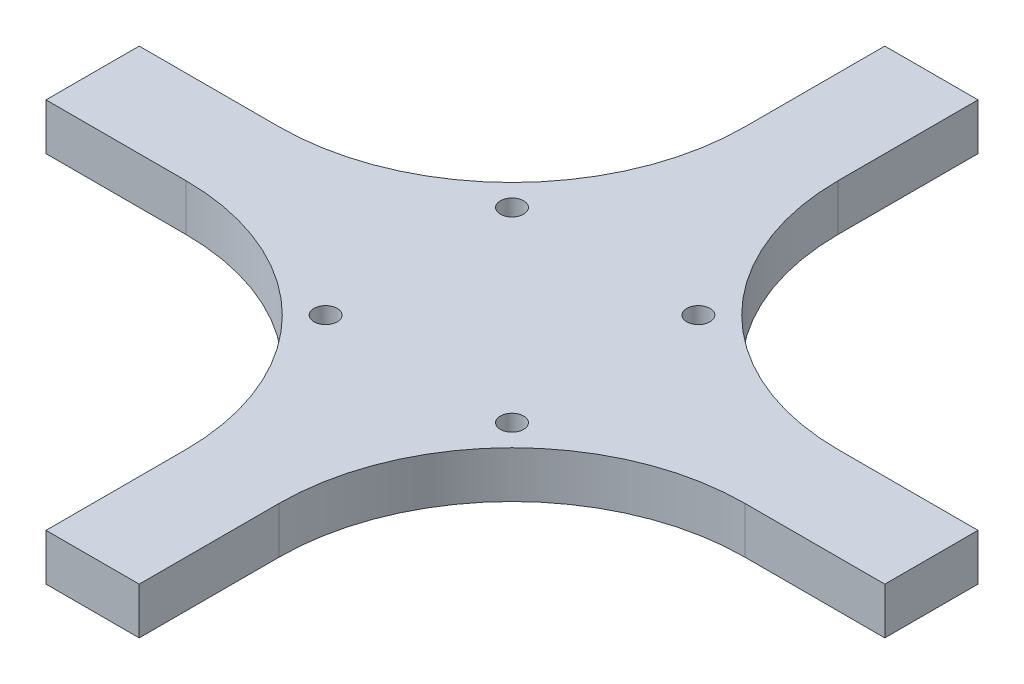
ISO-10303-21;
HEADER;
FILE_DESCRIPTION(('STEP AP214'),'2;1');
FILE_NAME('part.step','',(''),(''),'','','');
FILE_SCHEMA(('AUTOMOTIVE_DESIGN { 1 0 10303 214 1 1 1 1 }'));
ENDSEC;
DATA;
#1=APPLICATION_CONTEXT('core data for automotive mechanical design processes');
#2=APPLICATION_PROTOCOL_DEFINITION('international standard','automotive_design',2000,#1);
#3=PRODUCT_CONTEXT('',#1,'mechanical');
#4=PRODUCT('Part','Part','',(#3));
#5=PRODUCT_RELATED_PRODUCT_CATEGORY('part','',(#4));
#6=PRODUCT_DEFINITION_FORMATION('','',#4);
#7=PRODUCT_DEFINITION_CONTEXT('part definition',#1,'design');
#8=PRODUCT_DEFINITION('design','',#6,#7);
#9=PRODUCT_DEFINITION_SHAPE('','',#8);
#10=(LENGTH_UNIT() NAMED_UNIT(*) SI_UNIT(.MILLI.,.METRE.));
#11=(NAMED_UNIT(*) PLANE_ANGLE_UNIT() SI_UNIT($,.RADIAN.));
#12=(NAMED_UNIT(*) SI_UNIT($,.STERADIAN.) SOLID_ANGLE_UNIT());
#13=UNCERTAINTY_MEASURE_WITH_UNIT(LENGTH_MEASURE(1.E-05),#10,'distance_accuracy_value','');
#14=(GEOMETRIC_REPRESENTATION_CONTEXT(3) GLOBAL_UNCERTAINTY_ASSIGNED_CONTEXT((#13)) GLOBAL_UNIT_ASSIGNED_CONTEXT((#10,
#11,#12)) REPRESENTATION_CONTEXT('',''));
#15=CARTESIAN_POINT('',(0.,0.,0.));
#16=DIRECTION('',(0.,0.,1.));
#17=DIRECTION('',(1.,0.,0.));
#18=AXIS2_PLACEMENT_3D('',#15,#16,#17);
#19=CARTESIAN_POINT('',(-152.4,25.4,-152.4));
#20=DIRECTION('',(0.,1.,0.));
#21=DIRECTION('',(0.,0.,1.));
#22=AXIS2_PLACEMENT_3D('',#19,#20,#21);
#23=PLANE('',#22);
#24=CARTESIAN_POINT('',(50.8,25.4,50.8));
#25=DIRECTION('',(0.,1.,0.));
#26=DIRECTION('',(0.,0.,1.));
#27=AXIS2_PLACEMENT_3D('',#24,#25,#26);
#28=CIRCLE('',#27,6.35000000000002);
#29=CARTESIAN_POINT('',(50.8,25.4,44.45));
#30=VERTEX_POINT('',#29);
#31=EDGE_CURVE('E391',#30,#30,#28,.T.);
#32=ORIENTED_EDGE('',*,*,#31,.F.);
#33=EDGE_LOOP('',(#32));
#34=FACE_BOUND('',#33,.T.);
#35=CARTESIAN_POINT('',(-50.8,25.4,50.8));
#36=DIRECTION('',(0.,1.,0.));
#37=DIRECTION('',(0.,0.,1.));
#38=AXIS2_PLACEMENT_3D('',#35,#36,#37);
#39=CIRCLE('',#38,6.35);
#40=CARTESIAN_POINT('',(-50.8,25.4,44.45));
#41=VERTEX_POINT('',#40);
#42=EDGE_CURVE('E396',#41,#41,#39,.F.);
#43=ORIENTED_EDGE('',*,*,#42,.T.);
#44=EDGE_LOOP('',(#43));
#45=FACE_BOUND('',#44,.T.);
#46=CARTESIAN_POINT('',(-152.4,25.4,-152.4));
#47=DIRECTION('',(0.,-1.,0.));
#48=DIRECTION('',(0.,0.,1.));
#49=AXIS2_PLACEMENT_3D('',#46,#47,#48);
#50=CIRCLE('',#49,127.);
#51=CARTESIAN_POINT('',(-25.4,25.4,-152.4));
#52=VERTEX_POINT('',#51);
#53=CARTESIAN_POINT('',(-152.4,25.4,-25.4));
#54=VERTEX_POINT('',#53);
#55=EDGE_CURVE('E242',#52,#54,#50,.T.);
#56=ORIENTED_EDGE('',*,*,#55,.T.);
#57=DIRECTION('',(-1.,0.,0.));
#58=VECTOR('',#57,1.);
#59=CARTESIAN_POINT('',(-152.4,25.4,-25.4));
#60=LINE('',#59,#58);
#61=CARTESIAN_POINT('',(-228.6,25.4,-25.4));
#62=VERTEX_POINT('',#61);
#63=EDGE_CURVE('E130',#54,#62,#60,.T.);
#64=ORIENTED_EDGE('',*,*,#63,.T.);
#65=DIRECTION('',(0.,0.,1.));
#66=VECTOR('',#65,1.);
#67=CARTESIAN_POINT('',(-228.6,25.4,-25.4));
#68=LINE('',#67,#66);
#69=CARTESIAN_POINT('',(-228.6,25.4,25.4));
#70=VERTEX_POINT('',#69);
#71=EDGE_CURVE('E295',#62,#70,#68,.T.);
#72=ORIENTED_EDGE('',*,*,#71,.T.);
#73=DIRECTION('',(1.,0.,0.));
#74=VECTOR('',#73,1.);
#75=CARTESIAN_POINT('',(-152.4,25.4,25.4000000000001));
#76=LINE('',#75,#74);
#77=CARTESIAN_POINT('',(-152.4,25.4,25.4000000000001));
#78=VERTEX_POINT('',#77);
#79=EDGE_CURVE('E315',#70,#78,#76,.T.);
#80=ORIENTED_EDGE('',*,*,#79,.T.);
#81=CARTESIAN_POINT('',(-152.4,25.4,152.4));
#82=DIRECTION('',(0.,-1.,0.));
#83=DIRECTION('',(0.,0.,-1.));
#84=AXIS2_PLACEMENT_3D('',#81,#82,#83);
#85=CIRCLE('',#84,127.);
#86=CARTESIAN_POINT('',(-25.4000000000001,25.4,152.4));
#87=VERTEX_POINT('',#86);
#88=EDGE_CURVE('E311',#78,#87,#85,.T.);
#89=ORIENTED_EDGE('',*,*,#88,.T.);
#90=DIRECTION('',(0.,0.,1.));
#91=VECTOR('',#90,1.);
#92=CARTESIAN_POINT('',(-25.4,25.4,152.4));
#93=LINE('',#92,#91);
#94=CARTESIAN_POINT('',(-25.3999999999999,25.4,228.6));
#95=VERTEX_POINT('',#94);
#96=EDGE_CURVE('E314',#87,#95,#93,.T.);
#97=ORIENTED_EDGE('',*,*,#96,.T.);
#98=DIRECTION('',(1.,0.,0.));
#99=VECTOR('',#98,1.);
#100=CARTESIAN_POINT('',(-25.3999999999999,25.4,228.6));
#101=LINE('',#100,#99);
#102=CARTESIAN_POINT('',(25.4000000000001,25.4,228.6));
#103=VERTEX_POINT('',#102);
#104=EDGE_CURVE('E319',#95,#103,#101,.T.);
#105=ORIENTED_EDGE('',*,*,#104,.T.);
#106=DIRECTION('',(0.,0.,-1.));
#107=VECTOR('',#106,1.);
#108=CARTESIAN_POINT('',(25.4,25.4,152.4));
#109=LINE('',#108,#107);
#110=CARTESIAN_POINT('',(25.4,25.4,152.4));
#111=VERTEX_POINT('',#110);
#112=EDGE_CURVE('E326',#103,#111,#109,.T.);
#113=ORIENTED_EDGE('',*,*,#112,.T.);
#114=CARTESIAN_POINT('',(152.4,25.4,152.4));
#115=DIRECTION('',(0.,-1.,0.));
#116=DIRECTION('',(0.,0.,1.));
#117=AXIS2_PLACEMENT_3D('',#114,#115,#116);
#118=CIRCLE('',#117,127.);
#119=CARTESIAN_POINT('',(152.4,25.4,25.4));
#120=VERTEX_POINT('',#119);
#121=EDGE_CURVE('E329',#111,#120,#118,.T.);
#122=ORIENTED_EDGE('',*,*,#121,.T.);
#123=DIRECTION('',(1.,0.,0.));
#124=VECTOR('',#123,1.);
#125=CARTESIAN_POINT('',(152.4,25.4,25.4));
#126=LINE('',#125,#124);
#127=CARTESIAN_POINT('',(228.6,25.4,25.4));
#128=VERTEX_POINT('',#127);
#129=EDGE_CURVE('E332',#120,#128,#126,.T.);
#130=ORIENTED_EDGE('',*,*,#129,.T.);
#131=DIRECTION('',(0.,0.,-1.));
#132=VECTOR('',#131,1.);
#133=CARTESIAN_POINT('',(228.6,25.4,-25.4));
#134=LINE('',#133,#132);
#135=CARTESIAN_POINT('',(228.6,25.4,-25.4));
#136=VERTEX_POINT('',#135);
#137=EDGE_CURVE('E335',#128,#136,#134,.T.);
#138=ORIENTED_EDGE('',*,*,#137,.T.);
#139=DIRECTION('',(-1.,0.,0.));
#140=VECTOR('',#139,1.);
#141=CARTESIAN_POINT('',(152.4,25.4,-25.4));
#142=LINE('',#141,#140);
#143=CARTESIAN_POINT('',(152.4,25.4,-25.4));
#144=VERTEX_POINT('',#143);
#145=EDGE_CURVE('E338',#136,#144,#142,.T.);
#146=ORIENTED_EDGE('',*,*,#145,.T.);
#147=CARTESIAN_POINT('',(152.4,25.4,-152.4));
#148=DIRECTION('',(0.,-1.,0.));
#149=DIRECTION('',(0.,0.,-1.));
#150=AXIS2_PLACEMENT_3D('',#147,#148,#149);
#151=CIRCLE('',#150,127.);
#152=CARTESIAN_POINT('',(25.4000000000001,25.4,-152.4));
#153=VERTEX_POINT('',#152);
#154=EDGE_CURVE('E173',#144,#153,#151,.T.);
#155=ORIENTED_EDGE('',*,*,#154,.T.);
#156=DIRECTION('',(0.,0.,-1.));
#157=VECTOR('',#156,1.);
#158=CARTESIAN_POINT('',(25.4,25.4,-152.4));
#159=LINE('',#158,#157);
#160=CARTESIAN_POINT('',(25.4,25.4,-228.6));
#161=VERTEX_POINT('',#160);
#162=EDGE_CURVE('E167',#153,#161,#159,.T.);
#163=ORIENTED_EDGE('',*,*,#162,.T.);
#164=DIRECTION('',(-1.,0.,0.));
#165=VECTOR('',#164,1.);
#166=CARTESIAN_POINT('',(-25.4,25.4,-228.6));
#167=LINE('',#166,#165);
#168=CARTESIAN_POINT('',(-25.4,25.4,-228.6));
#169=VERTEX_POINT('',#168);
#170=EDGE_CURVE('E171',#161,#169,#167,.T.);
#171=ORIENTED_EDGE('',*,*,#170,.T.);
#172=DIRECTION('',(0.,0.,1.));
#173=VECTOR('',#172,1.);
#174=CARTESIAN_POINT('',(-25.4,25.4,-152.4));
#175=LINE('',#174,#173);
#176=EDGE_CURVE('E63',#169,#52,#175,.T.);
#177=ORIENTED_EDGE('',*,*,#176,.T.);
#178=EDGE_LOOP('',(#56,#64,#72,#80,#89,#97,#105,#113,#122,#130,#138,#146,#155,#163,#171,#177));
#179=FACE_BOUND('',#178,.T.);
#180=CARTESIAN_POINT('',(50.8,25.4,-50.8));
#181=DIRECTION('',(0.,1.,0.));
#182=DIRECTION('',(0.,0.,1.));
#183=AXIS2_PLACEMENT_3D('',#180,#181,#182);
#184=CIRCLE('',#183,6.35);
#185=CARTESIAN_POINT('',(50.8,25.4,-57.15));
#186=VERTEX_POINT('',#185);
#187=EDGE_CURVE('E402',#186,#186,#184,.F.);
#188=ORIENTED_EDGE('',*,*,#187,.T.);
#189=EDGE_LOOP('',(#188));
#190=FACE_BOUND('',#189,.T.);
#191=CARTESIAN_POINT('',(-50.8,25.4,-50.8));
#192=DIRECTION('',(0.,1.,0.));
#193=DIRECTION('',(0.,0.,1.));
#194=AXIS2_PLACEMENT_3D('',#191,#192,#193);
#195=CIRCLE('',#194,6.35000000000001);
#196=CARTESIAN_POINT('',(-50.8,25.4,-57.15));
#197=VERTEX_POINT('',#196);
#198=EDGE_CURVE('E413',#197,#197,#195,.T.);
#199=ORIENTED_EDGE('',*,*,#198,.F.);
#200=EDGE_LOOP('',(#199));
#201=FACE_BOUND('',#200,.T.);
#202=ADVANCED_FACE('F45',(#34,#45,#179,#190,#201),#23,.T.);
#203=CARTESIAN_POINT('',(-152.4,0.,-152.4));
#204=DIRECTION('',(0.,1.,0.));
#205=DIRECTION('',(0.,0.,1.));
#206=AXIS2_PLACEMENT_3D('',#203,#204,#205);
#207=PLANE('',#206);
#208=CARTESIAN_POINT('',(50.8,0.,-50.8));
#209=DIRECTION('',(0.,-1.,0.));
#210=DIRECTION('',(0.,0.,-1.));
#211=AXIS2_PLACEMENT_3D('',#208,#209,#210);
#212=CIRCLE('',#211,6.35);
#213=CARTESIAN_POINT('',(50.8,0.,-57.15));
#214=VERTEX_POINT('',#213);
#215=EDGE_CURVE('E408',#214,#214,#212,.T.);
#216=ORIENTED_EDGE('',*,*,#215,.F.);
#217=EDGE_LOOP('',(#216));
#218=FACE_BOUND('',#217,.T.);
#219=CARTESIAN_POINT('',(-50.8,0.,50.8));
#220=DIRECTION('',(0.,-1.,0.));
#221=DIRECTION('',(0.,0.,-1.));
#222=AXIS2_PLACEMENT_3D('',#219,#220,#221);
#223=CIRCLE('',#222,6.35);
#224=CARTESIAN_POINT('',(-50.8,0.,44.45));
#225=VERTEX_POINT('',#224);
#226=EDGE_CURVE('E200',#225,#225,#223,.T.);
#227=ORIENTED_EDGE('',*,*,#226,.F.);
#228=EDGE_LOOP('',(#227));
#229=FACE_BOUND('',#228,.T.);
#230=CARTESIAN_POINT('',(-152.4,0.,-152.4));
#231=DIRECTION('',(0.,-1.,0.));
#232=DIRECTION('',(0.,0.,1.));
#233=AXIS2_PLACEMENT_3D('',#230,#231,#232);
#234=CIRCLE('',#233,127.);
#235=CARTESIAN_POINT('',(-25.4,0.,-152.4));
#236=VERTEX_POINT('',#235);
#237=CARTESIAN_POINT('',(-152.4,0.,-25.4));
#238=VERTEX_POINT('',#237);
#239=EDGE_CURVE('E195',#236,#238,#234,.T.);
#240=ORIENTED_EDGE('',*,*,#239,.F.);
#241=DIRECTION('',(0.,0.,1.));
#242=VECTOR('',#241,1.);
#243=CARTESIAN_POINT('',(-25.4,0.,-152.4));
#244=LINE('',#243,#242);
#245=CARTESIAN_POINT('',(-25.4,0.,-228.6));
#246=VERTEX_POINT('',#245);
#247=EDGE_CURVE('E122',#246,#236,#244,.T.);
#248=ORIENTED_EDGE('',*,*,#247,.F.);
#249=DIRECTION('',(-1.,0.,0.));
#250=VECTOR('',#249,1.);
#251=CARTESIAN_POINT('',(-25.4,0.,-228.6));
#252=LINE('',#251,#250);
#253=CARTESIAN_POINT('',(25.4,0.,-228.6));
#254=VERTEX_POINT('',#253);
#255=EDGE_CURVE('E116',#254,#246,#252,.T.);
#256=ORIENTED_EDGE('',*,*,#255,.F.);
#257=DIRECTION('',(0.,0.,-1.));
#258=VECTOR('',#257,1.);
#259=CARTESIAN_POINT('',(25.4,0.,-152.4));
#260=LINE('',#259,#258);
#261=CARTESIAN_POINT('',(25.4000000000001,0.,-152.4));
#262=VERTEX_POINT('',#261);
#263=EDGE_CURVE('E182',#262,#254,#260,.T.);
#264=ORIENTED_EDGE('',*,*,#263,.F.);
#265=CARTESIAN_POINT('',(152.4,0.,-152.4));
#266=DIRECTION('',(0.,-1.,0.));
#267=DIRECTION('',(0.,0.,-1.));
#268=AXIS2_PLACEMENT_3D('',#265,#266,#267);
#269=CIRCLE('',#268,127.);
#270=CARTESIAN_POINT('',(152.4,0.,-25.4));
#271=VERTEX_POINT('',#270);
#272=EDGE_CURVE('E233',#271,#262,#269,.T.);
#273=ORIENTED_EDGE('',*,*,#272,.F.);
#274=DIRECTION('',(-1.,0.,0.));
#275=VECTOR('',#274,1.);
#276=CARTESIAN_POINT('',(152.4,0.,-25.4));
#277=LINE('',#276,#275);
#278=CARTESIAN_POINT('',(228.6,0.,-25.4));
#279=VERTEX_POINT('',#278);
#280=EDGE_CURVE('E230',#279,#271,#277,.T.);
#281=ORIENTED_EDGE('',*,*,#280,.F.);
#282=DIRECTION('',(0.,0.,-1.));
#283=VECTOR('',#282,1.);
#284=CARTESIAN_POINT('',(228.6,0.,-25.4));
#285=LINE('',#284,#283);
#286=CARTESIAN_POINT('',(228.6,0.,25.4));
#287=VERTEX_POINT('',#286);
#288=EDGE_CURVE('E227',#287,#279,#285,.T.);
#289=ORIENTED_EDGE('',*,*,#288,.F.);
#290=DIRECTION('',(1.,0.,0.));
#291=VECTOR('',#290,1.);
#292=CARTESIAN_POINT('',(152.4,0.,25.4));
#293=LINE('',#292,#291);
#294=CARTESIAN_POINT('',(152.4,0.,25.4));
#295=VERTEX_POINT('',#294);
#296=EDGE_CURVE('E224',#295,#287,#293,.T.);
#297=ORIENTED_EDGE('',*,*,#296,.F.);
#298=CARTESIAN_POINT('',(152.4,0.,152.4));
#299=DIRECTION('',(0.,-1.,0.));
#300=DIRECTION('',(0.,0.,1.));
#301=AXIS2_PLACEMENT_3D('',#298,#299,#300);
#302=CIRCLE('',#301,127.);
#303=CARTESIAN_POINT('',(25.4,0.,152.4));
#304=VERTEX_POINT('',#303);
#305=EDGE_CURVE('E221',#304,#295,#302,.T.);
#306=ORIENTED_EDGE('',*,*,#305,.F.);
#307=DIRECTION('',(0.,0.,-1.));
#308=VECTOR('',#307,1.);
#309=CARTESIAN_POINT('',(25.4,0.,152.4));
#310=LINE('',#309,#308);
#311=CARTESIAN_POINT('',(25.4000000000001,0.,228.6));
#312=VERTEX_POINT('',#311);
#313=EDGE_CURVE('E218',#312,#304,#310,.T.);
#314=ORIENTED_EDGE('',*,*,#313,.F.);
#315=DIRECTION('',(1.,0.,0.));
#316=VECTOR('',#315,1.);
#317=CARTESIAN_POINT('',(-25.3999999999999,0.,228.6));
#318=LINE('',#317,#316);
#319=CARTESIAN_POINT('',(-25.3999999999999,0.,228.6));
#320=VERTEX_POINT('',#319);
#321=EDGE_CURVE('E215',#320,#312,#318,.T.);
#322=ORIENTED_EDGE('',*,*,#321,.F.);
#323=DIRECTION('',(0.,0.,1.));
#324=VECTOR('',#323,1.);
#325=CARTESIAN_POINT('',(-25.4,0.,152.4));
#326=LINE('',#325,#324);
#327=CARTESIAN_POINT('',(-25.4000000000001,0.,152.4));
#328=VERTEX_POINT('',#327);
#329=EDGE_CURVE('E212',#328,#320,#326,.T.);
#330=ORIENTED_EDGE('',*,*,#329,.F.);
#331=CARTESIAN_POINT('',(-152.4,0.,152.4));
#332=DIRECTION('',(0.,-1.,0.));
#333=DIRECTION('',(0.,0.,-1.));
#334=AXIS2_PLACEMENT_3D('',#331,#332,#333);
#335=CIRCLE('',#334,127.);
#336=CARTESIAN_POINT('',(-152.4,0.,25.4000000000001));
#337=VERTEX_POINT('',#336);
#338=EDGE_CURVE('E209',#337,#328,#335,.T.);
#339=ORIENTED_EDGE('',*,*,#338,.F.);
#340=DIRECTION('',(1.,0.,0.));
#341=VECTOR('',#340,1.);
#342=CARTESIAN_POINT('',(-152.4,0.,25.4000000000001));
#343=LINE('',#342,#341);
#344=CARTESIAN_POINT('',(-228.6,0.,25.4));
#345=VERTEX_POINT('',#344);
#346=EDGE_CURVE('E206',#345,#337,#343,.T.);
#347=ORIENTED_EDGE('',*,*,#346,.F.);
#348=DIRECTION('',(0.,0.,1.));
#349=VECTOR('',#348,1.);
#350=CARTESIAN_POINT('',(-228.6,0.,-25.4));
#351=LINE('',#350,#349);
#352=CARTESIAN_POINT('',(-228.6,0.,-25.4));
#353=VERTEX_POINT('',#352);
#354=EDGE_CURVE('E203',#353,#345,#351,.T.);
#355=ORIENTED_EDGE('',*,*,#354,.F.);
#356=DIRECTION('',(-1.,0.,0.));
#357=VECTOR('',#356,1.);
#358=CARTESIAN_POINT('',(-152.4,0.,-25.4));
#359=LINE('',#358,#357);
#360=EDGE_CURVE('E199',#238,#353,#359,.T.);
#361=ORIENTED_EDGE('',*,*,#360,.F.);
#362=EDGE_LOOP('',(#240,#248,#256,#264,#273,#281,#289,#297,#306,#314,#322,#330,#339,#347,#355,#361));
#363=FACE_BOUND('',#362,.T.);
#364=CARTESIAN_POINT('',(50.8,0.,50.8));
#365=DIRECTION('',(0.,1.,0.));
#366=DIRECTION('',(0.,0.,1.));
#367=AXIS2_PLACEMENT_3D('',#364,#365,#366);
#368=CIRCLE('',#367,6.35000000000002);
#369=CARTESIAN_POINT('',(50.8,0.,44.45));
#370=VERTEX_POINT('',#369);
#371=EDGE_CURVE('E394',#370,#370,#368,.T.);
#372=ORIENTED_EDGE('',*,*,#371,.T.);
#373=EDGE_LOOP('',(#372));
#374=FACE_BOUND('',#373,.T.);
#375=CARTESIAN_POINT('',(-50.8,0.,-50.8));
#376=DIRECTION('',(0.,1.,0.));
#377=DIRECTION('',(0.,0.,1.));
#378=AXIS2_PLACEMENT_3D('',#375,#376,#377);
#379=CIRCLE('',#378,6.35000000000001);
#380=CARTESIAN_POINT('',(-50.8,0.,-57.15));
#381=VERTEX_POINT('',#380);
#382=EDGE_CURVE('E412',#381,#381,#379,.T.);
#383=ORIENTED_EDGE('',*,*,#382,.T.);
#384=EDGE_LOOP('',(#383));
#385=FACE_BOUND('',#384,.T.);
#386=ADVANCED_FACE('F299',(#218,#229,#363,#374,#385),#207,.F.);
#387=CARTESIAN_POINT('',(-152.4,25.4,-152.4));
#388=DIRECTION('',(0.,-1.,0.));
#389=DIRECTION('',(0.,0.,-1.));
#390=AXIS2_PLACEMENT_3D('',#387,#388,#389);
#391=CYLINDRICAL_SURFACE('',#390,127.);
#392=ORIENTED_EDGE('',*,*,#239,.T.);
#393=DIRECTION('',(0.,-1.,0.));
#394=VECTOR('',#393,1.);
#395=CARTESIAN_POINT('',(-152.4,25.4,-25.4));
#396=LINE('',#395,#394);
#397=EDGE_CURVE('E11',#54,#238,#396,.T.);
#398=ORIENTED_EDGE('',*,*,#397,.F.);
#399=ORIENTED_EDGE('',*,*,#55,.F.);
#400=DIRECTION('',(0.,-1.,0.));
#401=VECTOR('',#400,1.);
#402=CARTESIAN_POINT('',(-25.4,25.4,-152.4));
#403=LINE('',#402,#401);
#404=EDGE_CURVE('E191',#52,#236,#403,.T.);
#405=ORIENTED_EDGE('',*,*,#404,.T.);
#406=EDGE_LOOP('',(#392,#398,#399,#405));
#407=FACE_BOUND('',#406,.T.);
#408=ADVANCED_FACE('F47',(#407),#391,.F.);
#409=CARTESIAN_POINT('',(-152.4,25.4,-25.4));
#410=DIRECTION('',(0.,0.,1.));
#411=DIRECTION('',(1.,0.,0.));
#412=AXIS2_PLACEMENT_3D('',#409,#410,#411);
#413=PLANE('',#412);
#414=ORIENTED_EDGE('',*,*,#360,.T.);
#415=DIRECTION('',(0.,-1.,0.));
#416=VECTOR('',#415,1.);
#417=CARTESIAN_POINT('',(-228.6,25.4,-25.4));
#418=LINE('',#417,#416);
#419=EDGE_CURVE('E55',#62,#353,#418,.T.);
#420=ORIENTED_EDGE('',*,*,#419,.F.);
#421=ORIENTED_EDGE('',*,*,#63,.F.);
#422=ORIENTED_EDGE('',*,*,#397,.T.);
#423=EDGE_LOOP('',(#414,#420,#421,#422));
#424=FACE_BOUND('',#423,.T.);
#425=ADVANCED_FACE('F573',(#424),#413,.F.);
#426=CARTESIAN_POINT('',(-228.6,25.4,-25.4));
#427=DIRECTION('',(1.,0.,0.));
#428=DIRECTION('',(0.,0.,-1.));
#429=AXIS2_PLACEMENT_3D('',#426,#427,#428);
#430=PLANE('',#429);
#431=ORIENTED_EDGE('',*,*,#354,.T.);
#432=DIRECTION('',(0.,-1.,0.));
#433=VECTOR('',#432,1.);
#434=CARTESIAN_POINT('',(-228.6,25.4,25.4));
#435=LINE('',#434,#433);
#436=EDGE_CURVE('E285',#70,#345,#435,.T.);
#437=ORIENTED_EDGE('',*,*,#436,.F.);
#438=ORIENTED_EDGE('',*,*,#71,.F.);
#439=ORIENTED_EDGE('',*,*,#419,.T.);
#440=EDGE_LOOP('',(#431,#437,#438,#439));
#441=FACE_BOUND('',#440,.T.);
#442=ADVANCED_FACE('F293',(#441),#430,.F.);
#443=CARTESIAN_POINT('',(-152.4,25.4,25.4000000000001));
#444=DIRECTION('',(0.,0.,-1.));
#445=DIRECTION('',(-1.,0.,0.));
#446=AXIS2_PLACEMENT_3D('',#443,#444,#445);
#447=PLANE('',#446);
#448=ORIENTED_EDGE('',*,*,#346,.T.);
#449=DIRECTION('',(0.,-1.,0.));
#450=VECTOR('',#449,1.);
#451=CARTESIAN_POINT('',(-152.4,25.4,25.4000000000001));
#452=LINE('',#451,#450);
#453=EDGE_CURVE('E281',#78,#337,#452,.T.);
#454=ORIENTED_EDGE('',*,*,#453,.F.);
#455=ORIENTED_EDGE('',*,*,#79,.F.);
#456=ORIENTED_EDGE('',*,*,#436,.T.);
#457=EDGE_LOOP('',(#448,#454,#455,#456));
#458=FACE_BOUND('',#457,.T.);
#459=ADVANCED_FACE('F305',(#458),#447,.F.);
#460=CARTESIAN_POINT('',(-152.4,25.4,152.4));
#461=DIRECTION('',(0.,-1.,0.));
#462=DIRECTION('',(0.,0.,-1.));
#463=AXIS2_PLACEMENT_3D('',#460,#461,#462);
#464=CYLINDRICAL_SURFACE('',#463,127.);
#465=ORIENTED_EDGE('',*,*,#338,.T.);
#466=DIRECTION('',(0.,-1.,0.));
#467=VECTOR('',#466,1.);
#468=CARTESIAN_POINT('',(-25.4000000000001,25.4,152.4));
#469=LINE('',#468,#467);
#470=EDGE_CURVE('E277',#87,#328,#469,.T.);
#471=ORIENTED_EDGE('',*,*,#470,.F.);
#472=ORIENTED_EDGE('',*,*,#88,.F.);
#473=ORIENTED_EDGE('',*,*,#453,.T.);
#474=EDGE_LOOP('',(#465,#471,#472,#473));
#475=FACE_BOUND('',#474,.T.);
#476=ADVANCED_FACE('F309',(#475),#464,.F.);
#477=CARTESIAN_POINT('',(-25.4,25.4,152.4));
#478=DIRECTION('',(1.,0.,0.));
#479=DIRECTION('',(0.,0.,-1.));
#480=AXIS2_PLACEMENT_3D('',#477,#478,#479);
#481=PLANE('',#480);
#482=ORIENTED_EDGE('',*,*,#329,.T.);
#483=DIRECTION('',(0.,-1.,0.));
#484=VECTOR('',#483,1.);
#485=CARTESIAN_POINT('',(-25.3999999999999,25.4,228.6));
#486=LINE('',#485,#484);
#487=EDGE_CURVE('E273',#95,#320,#486,.T.);
#488=ORIENTED_EDGE('',*,*,#487,.F.);
#489=ORIENTED_EDGE('',*,*,#96,.F.);
#490=ORIENTED_EDGE('',*,*,#470,.T.);
#491=EDGE_LOOP('',(#482,#488,#489,#490));
#492=FACE_BOUND('',#491,.T.);
#493=ADVANCED_FACE('F542',(#492),#481,.F.);
#494=CARTESIAN_POINT('',(-25.3999999999999,25.4,228.6));
#495=DIRECTION('',(0.,0.,-1.));
#496=DIRECTION('',(-1.,0.,0.));
#497=AXIS2_PLACEMENT_3D('',#494,#495,#496);
#498=PLANE('',#497);
#499=ORIENTED_EDGE('',*,*,#321,.T.);
#500=DIRECTION('',(0.,-1.,0.));
#501=VECTOR('',#500,1.);
#502=CARTESIAN_POINT('',(25.4000000000001,25.4,228.6));
#503=LINE('',#502,#501);
#504=EDGE_CURVE('E269',#103,#312,#503,.T.);
#505=ORIENTED_EDGE('',*,*,#504,.F.);
#506=ORIENTED_EDGE('',*,*,#104,.F.);
#507=ORIENTED_EDGE('',*,*,#487,.T.);
#508=EDGE_LOOP('',(#499,#505,#506,#507));
#509=FACE_BOUND('',#508,.T.);
#510=ADVANCED_FACE('F533',(#509),#498,.F.);
#511=CARTESIAN_POINT('',(25.4,25.4,152.4));
#512=DIRECTION('',(-1.,0.,0.));
#513=DIRECTION('',(0.,0.,1.));
#514=AXIS2_PLACEMENT_3D('',#511,#512,#513);
#515=PLANE('',#514);
#516=ORIENTED_EDGE('',*,*,#313,.T.);
#517=DIRECTION('',(0.,-1.,0.));
#518=VECTOR('',#517,1.);
#519=CARTESIAN_POINT('',(25.4,25.4,152.4));
#520=LINE('',#519,#518);
#521=EDGE_CURVE('E265',#111,#304,#520,.T.);
#522=ORIENTED_EDGE('',*,*,#521,.F.);
#523=ORIENTED_EDGE('',*,*,#112,.F.);
#524=ORIENTED_EDGE('',*,*,#504,.T.);
#525=EDGE_LOOP('',(#516,#522,#523,#524));
#526=FACE_BOUND('',#525,.T.);
#527=ADVANCED_FACE('F524',(#526),#515,.F.);
#528=CARTESIAN_POINT('',(152.4,25.4,152.4));
#529=DIRECTION('',(0.,-1.,0.));
#530=DIRECTION('',(0.,0.,-1.));
#531=AXIS2_PLACEMENT_3D('',#528,#529,#530);
#532=CYLINDRICAL_SURFACE('',#531,127.);
#533=ORIENTED_EDGE('',*,*,#305,.T.);
#534=DIRECTION('',(0.,-1.,0.));
#535=VECTOR('',#534,1.);
#536=CARTESIAN_POINT('',(152.4,25.4,25.4));
#537=LINE('',#536,#535);
#538=EDGE_CURVE('E261',#120,#295,#537,.T.);
#539=ORIENTED_EDGE('',*,*,#538,.F.);
#540=ORIENTED_EDGE('',*,*,#121,.F.);
#541=ORIENTED_EDGE('',*,*,#521,.T.);
#542=EDGE_LOOP('',(#533,#539,#540,#541));
#543=FACE_BOUND('',#542,.T.);
#544=ADVANCED_FACE('F515',(#543),#532,.F.);
#545=CARTESIAN_POINT('',(152.4,25.4,25.4));
#546=DIRECTION('',(0.,0.,-1.));
#547=DIRECTION('',(-1.,0.,0.));
#548=AXIS2_PLACEMENT_3D('',#545,#546,#547);
#549=PLANE('',#548);
#550=ORIENTED_EDGE('',*,*,#296,.T.);
#551=DIRECTION('',(0.,-1.,0.));
#552=VECTOR('',#551,1.);
#553=CARTESIAN_POINT('',(228.6,25.4,25.4));
#554=LINE('',#553,#552);
#555=EDGE_CURVE('E257',#128,#287,#554,.T.);
#556=ORIENTED_EDGE('',*,*,#555,.F.);
#557=ORIENTED_EDGE('',*,*,#129,.F.);
#558=ORIENTED_EDGE('',*,*,#538,.T.);
#559=EDGE_LOOP('',(#550,#556,#557,#558));
#560=FACE_BOUND('',#559,.T.);
#561=ADVANCED_FACE('F506',(#560),#549,.F.);
#562=CARTESIAN_POINT('',(228.6,25.4,-25.4));
#563=DIRECTION('',(-1.,0.,0.));
#564=DIRECTION('',(0.,0.,1.));
#565=AXIS2_PLACEMENT_3D('',#562,#563,#564);
#566=PLANE('',#565);
#567=ORIENTED_EDGE('',*,*,#288,.T.);
#568=DIRECTION('',(0.,-1.,0.));
#569=VECTOR('',#568,1.);
#570=CARTESIAN_POINT('',(228.6,25.4,-25.4));
#571=LINE('',#570,#569);
#572=EDGE_CURVE('E253',#136,#279,#571,.T.);
#573=ORIENTED_EDGE('',*,*,#572,.F.);
#574=ORIENTED_EDGE('',*,*,#137,.F.);
#575=ORIENTED_EDGE('',*,*,#555,.T.);
#576=EDGE_LOOP('',(#567,#573,#574,#575));
#577=FACE_BOUND('',#576,.T.);
#578=ADVANCED_FACE('F498',(#577),#566,.F.);
#579=CARTESIAN_POINT('',(152.4,25.4,-25.4));
#580=DIRECTION('',(0.,0.,1.));
#581=DIRECTION('',(1.,0.,0.));
#582=AXIS2_PLACEMENT_3D('',#579,#580,#581);
#583=PLANE('',#582);
#584=ORIENTED_EDGE('',*,*,#280,.T.);
#585=DIRECTION('',(0.,-1.,0.));
#586=VECTOR('',#585,1.);
#587=CARTESIAN_POINT('',(152.4,25.4,-25.4));
#588=LINE('',#587,#586);
#589=EDGE_CURVE('E249',#144,#271,#588,.T.);
#590=ORIENTED_EDGE('',*,*,#589,.F.);
#591=ORIENTED_EDGE('',*,*,#145,.F.);
#592=ORIENTED_EDGE('',*,*,#572,.T.);
#593=EDGE_LOOP('',(#584,#590,#591,#592));
#594=FACE_BOUND('',#593,.T.);
#595=ADVANCED_FACE('F346',(#594),#583,.F.);
#596=CARTESIAN_POINT('',(152.4,25.4,-152.4));
#597=DIRECTION('',(0.,-1.,0.));
#598=DIRECTION('',(0.,0.,-1.));
#599=AXIS2_PLACEMENT_3D('',#596,#597,#598);
#600=CYLINDRICAL_SURFACE('',#599,127.);
#601=ORIENTED_EDGE('',*,*,#272,.T.);
#602=DIRECTION('',(0.,-1.,0.));
#603=VECTOR('',#602,1.);
#604=CARTESIAN_POINT('',(25.4000000000001,25.4,-152.4));
#605=LINE('',#604,#603);
#606=EDGE_CURVE('E184',#153,#262,#605,.T.);
#607=ORIENTED_EDGE('',*,*,#606,.F.);
#608=ORIENTED_EDGE('',*,*,#154,.F.);
#609=ORIENTED_EDGE('',*,*,#589,.T.);
#610=EDGE_LOOP('',(#601,#607,#608,#609));
#611=FACE_BOUND('',#610,.T.);
#612=ADVANCED_FACE('F350',(#611),#600,.F.);
#613=CARTESIAN_POINT('',(25.4,25.4,-152.4));
#614=DIRECTION('',(-1.,0.,0.));
#615=DIRECTION('',(0.,0.,1.));
#616=AXIS2_PLACEMENT_3D('',#613,#614,#615);
#617=PLANE('',#616);
#618=ORIENTED_EDGE('',*,*,#263,.T.);
#619=DIRECTION('',(0.,-1.,0.));
#620=VECTOR('',#619,1.);
#621=CARTESIAN_POINT('',(25.4,25.4,-228.6));
#622=LINE('',#621,#620);
#623=EDGE_CURVE('E179',#161,#254,#622,.T.);
#624=ORIENTED_EDGE('',*,*,#623,.F.);
#625=ORIENTED_EDGE('',*,*,#162,.F.);
#626=ORIENTED_EDGE('',*,*,#606,.T.);
#627=EDGE_LOOP('',(#618,#624,#625,#626));
#628=FACE_BOUND('',#627,.T.);
#629=ADVANCED_FACE('F180',(#628),#617,.F.);
#630=CARTESIAN_POINT('',(-25.4,25.4,-228.6));
#631=DIRECTION('',(0.,0.,1.));
#632=DIRECTION('',(1.,0.,0.));
#633=AXIS2_PLACEMENT_3D('',#630,#631,#632);
#634=PLANE('',#633);
#635=ORIENTED_EDGE('',*,*,#255,.T.);
#636=DIRECTION('',(0.,-1.,0.));
#637=VECTOR('',#636,1.);
#638=CARTESIAN_POINT('',(-25.4,25.4,-228.6));
#639=LINE('',#638,#637);
#640=EDGE_CURVE('E185',#169,#246,#639,.T.);
#641=ORIENTED_EDGE('',*,*,#640,.F.);
#642=ORIENTED_EDGE('',*,*,#170,.F.);
#643=ORIENTED_EDGE('',*,*,#623,.T.);
#644=EDGE_LOOP('',(#635,#641,#642,#643));
#645=FACE_BOUND('',#644,.T.);
#646=ADVANCED_FACE('F187',(#645),#634,.F.);
#647=CARTESIAN_POINT('',(-25.4,25.4,-152.4));
#648=DIRECTION('',(1.,0.,0.));
#649=DIRECTION('',(0.,0.,-1.));
#650=AXIS2_PLACEMENT_3D('',#647,#648,#649);
#651=PLANE('',#650);
#652=ORIENTED_EDGE('',*,*,#247,.T.);
#653=ORIENTED_EDGE('',*,*,#404,.F.);
#654=ORIENTED_EDGE('',*,*,#176,.F.);
#655=ORIENTED_EDGE('',*,*,#640,.T.);
#656=EDGE_LOOP('',(#652,#653,#654,#655));
#657=FACE_BOUND('',#656,.T.);
#658=ADVANCED_FACE('F354',(#657),#651,.F.);
#659=CARTESIAN_POINT('',(-50.8,25.401,50.8));
#660=DIRECTION('',(0.,-1.,0.));
#661=DIRECTION('',(0.,0.,-1.));
#662=AXIS2_PLACEMENT_3D('',#659,#660,#661);
#663=CYLINDRICAL_SURFACE('',#662,6.35);
#664=CARTESIAN_POINT('',(-50.8,25.4,44.45));
#665=CARTESIAN_POINT('',(-50.8,25.1354166666667,44.45));
#666=CARTESIAN_POINT('',(-50.8,24.8708333333333,44.45));
#667=CARTESIAN_POINT('',(-50.8,24.3416666666667,44.45));
#668=CARTESIAN_POINT('',(-50.8,24.0770833333333,44.45));
#669=CARTESIAN_POINT('',(-50.8,23.5479166666667,44.45));
#670=CARTESIAN_POINT('',(-50.8,23.2833333333333,44.45));
#671=CARTESIAN_POINT('',(-50.8,22.7541666666667,44.45));
#672=CARTESIAN_POINT('',(-50.8,22.4895833333333,44.45));
#673=CARTESIAN_POINT('',(-50.8,21.9604166666667,44.45));
#674=CARTESIAN_POINT('',(-50.8,21.6958333333333,44.45));
#675=CARTESIAN_POINT('',(-50.8,21.1666666666667,44.45));
#676=CARTESIAN_POINT('',(-50.8,20.9020833333333,44.45));
#677=CARTESIAN_POINT('',(-50.8,20.3729166666667,44.45));
#678=CARTESIAN_POINT('',(-50.8,20.1083333333333,44.45));
#679=CARTESIAN_POINT('',(-50.8,19.5791666666667,44.45));
#680=CARTESIAN_POINT('',(-50.8,19.3145833333333,44.45));
#681=CARTESIAN_POINT('',(-50.8,18.7854166666667,44.45));
#682=CARTESIAN_POINT('',(-50.8,18.5208333333333,44.45));
#683=CARTESIAN_POINT('',(-50.8,17.9916666666667,44.45));
#684=CARTESIAN_POINT('',(-50.8,17.7270833333333,44.45));
#685=CARTESIAN_POINT('',(-50.8,17.1979166666667,44.45));
#686=CARTESIAN_POINT('',(-50.8,16.9333333333333,44.45));
#687=CARTESIAN_POINT('',(-50.8,16.4041666666667,44.45));
#688=CARTESIAN_POINT('',(-50.8,16.1395833333333,44.45));
#689=CARTESIAN_POINT('',(-50.8,15.6104166666667,44.45));
#690=CARTESIAN_POINT('',(-50.8,15.3458333333333,44.45));
#691=CARTESIAN_POINT('',(-50.8,14.8166666666667,44.45));
#692=CARTESIAN_POINT('',(-50.8,14.5520833333333,44.45));
#693=CARTESIAN_POINT('',(-50.8,14.0229166666667,44.45));
#694=CARTESIAN_POINT('',(-50.8,13.7583333333333,44.45));
#695=CARTESIAN_POINT('',(-50.8,13.2291666666667,44.45));
#696=CARTESIAN_POINT('',(-50.8,12.9645833333333,44.45));
#697=CARTESIAN_POINT('',(-50.8,12.4354166666667,44.45));
#698=CARTESIAN_POINT('',(-50.8,12.1708333333333,44.45));
#699=CARTESIAN_POINT('',(-50.8,11.6416666666667,44.45));
#700=CARTESIAN_POINT('',(-50.8,11.3770833333333,44.45));
#701=CARTESIAN_POINT('',(-50.8,10.8479166666667,44.45));
#702=CARTESIAN_POINT('',(-50.8,10.5833333333333,44.45));
#703=CARTESIAN_POINT('',(-50.8,10.0541666666667,44.45));
#704=CARTESIAN_POINT('',(-50.8,9.78958333333334,44.45));
#705=CARTESIAN_POINT('',(-50.8,9.26041666666667,44.45));
#706=CARTESIAN_POINT('',(-50.8,8.99583333333334,44.45));
#707=CARTESIAN_POINT('',(-50.8,8.46666666666667,44.45));
#708=CARTESIAN_POINT('',(-50.8,8.20208333333334,44.45));
#709=CARTESIAN_POINT('',(-50.8,7.67291666666667,44.45));
#710=CARTESIAN_POINT('',(-50.8,7.40833333333333,44.45));
#711=CARTESIAN_POINT('',(-50.8,6.87916666666667,44.45));
#712=CARTESIAN_POINT('',(-50.8,6.61458333333333,44.45));
#713=CARTESIAN_POINT('',(-50.8,6.08541666666667,44.45));
#714=CARTESIAN_POINT('',(-50.8,5.82083333333333,44.45));
#715=CARTESIAN_POINT('',(-50.8,5.29166666666667,44.45));
#716=CARTESIAN_POINT('',(-50.8,5.02708333333334,44.45));
#717=CARTESIAN_POINT('',(-50.8,4.49791666666667,44.45));
#718=CARTESIAN_POINT('',(-50.8,4.23333333333334,44.45));
#719=CARTESIAN_POINT('',(-50.8,3.70416666666667,44.45));
#720=CARTESIAN_POINT('',(-50.8,3.43958333333334,44.45));
#721=CARTESIAN_POINT('',(-50.8,2.91041666666667,44.45));
#722=CARTESIAN_POINT('',(-50.8,2.64583333333334,44.45));
#723=CARTESIAN_POINT('',(-50.8,2.11666666666667,44.45));
#724=CARTESIAN_POINT('',(-50.8,1.85208333333334,44.45));
#725=CARTESIAN_POINT('',(-50.8,1.32291666666667,44.45));
#726=CARTESIAN_POINT('',(-50.8,1.05833333333334,44.45));
#727=CARTESIAN_POINT('',(-50.8,0.52916666666667,44.45));
#728=CARTESIAN_POINT('',(-50.8,0.264583333333336,44.45));
#729=CARTESIAN_POINT('',(-50.8,0.,44.45));
#730=B_SPLINE_CURVE_WITH_KNOTS('',3,(#664,#665,#666,#667,#668,#669,#670,#671,#672,#673,#674,
#675,#676,#677,#678,#679,#680,#681,#682,#683,#684,#685,#686,#687,#688,#689,#690,#691,#692,#693,
#694,#695,#696,#697,#698,#699,#700,#701,#702,#703,#704,#705,#706,#707,#708,#709,#710,#711,#712,
#713,#714,#715,#716,#717,#718,#719,#720,#721,#722,#723,#724,#725,#726,#727,#728,#729),
.UNSPECIFIED.,.F.,.F.,(4,2,2,2,2,2,2,2,2,2,2,2,2,2,2,2,2,2,2,2,2,2,2,2,2,2,2,2,2,2,2,2,4),(0.,
0.793749999999999,1.5875,2.38125,3.175,3.96875,4.7625,5.55625,6.35,7.14375,7.9375,
8.73124999999999,9.525,10.31875,11.1125,11.90625,12.7,13.49375,14.2875,15.08125,15.875,16.66875,
17.4625,18.25625,19.05,19.84375,20.6375,21.43125,22.225,23.01875,23.8125,24.60625,25.4),.UNSPECIFIED.);
#731=EDGE_CURVE('BSEAM356',#41,#225,#730,.T.);
#732=ORIENTED_EDGE('',*,*,#42,.F.);
#733=ORIENTED_EDGE('',*,*,#226,.T.);
#734=ORIENTED_EDGE('',*,*,#731,.T.);
#735=ORIENTED_EDGE('',*,*,#731,.F.);
#736=EDGE_LOOP('',(#732,#734,#733,#735));
#737=FACE_BOUND('',#736,.T.);
#738=ADVANCED_FACE('F356',(#737),#663,.F.);
#739=CARTESIAN_POINT('',(50.8,25.401,50.8));
#740=DIRECTION('',(0.,-1.,0.));
#741=DIRECTION('',(0.,0.,-1.));
#742=AXIS2_PLACEMENT_3D('',#739,#740,#741);
#743=CYLINDRICAL_SURFACE('',#742,6.35000000000002);
#744=CARTESIAN_POINT('',(50.8,25.4,44.45));
#745=CARTESIAN_POINT('',(50.8,25.1354166666667,44.45));
#746=CARTESIAN_POINT('',(50.8,24.8708333333333,44.45));
#747=CARTESIAN_POINT('',(50.8,24.3416666666667,44.45));
#748=CARTESIAN_POINT('',(50.8,24.0770833333333,44.45));
#749=CARTESIAN_POINT('',(50.8,23.5479166666667,44.45));
#750=CARTESIAN_POINT('',(50.8,23.2833333333333,44.45));
#751=CARTESIAN_POINT('',(50.8,22.7541666666667,44.45));
#752=CARTESIAN_POINT('',(50.8,22.4895833333333,44.45));
#753=CARTESIAN_POINT('',(50.8,21.9604166666667,44.45));
#754=CARTESIAN_POINT('',(50.8,21.6958333333333,44.45));
#755=CARTESIAN_POINT('',(50.8,21.1666666666667,44.45));
#756=CARTESIAN_POINT('',(50.8,20.9020833333333,44.45));
#757=CARTESIAN_POINT('',(50.8,20.3729166666667,44.45));
#758=CARTESIAN_POINT('',(50.8,20.1083333333333,44.45));
#759=CARTESIAN_POINT('',(50.8,19.5791666666667,44.45));
#760=CARTESIAN_POINT('',(50.8,19.3145833333333,44.45));
#761=CARTESIAN_POINT('',(50.8,18.7854166666667,44.45));
#762=CARTESIAN_POINT('',(50.8,18.5208333333333,44.45));
#763=CARTESIAN_POINT('',(50.8,17.9916666666667,44.45));
#764=CARTESIAN_POINT('',(50.8,17.7270833333333,44.45));
#765=CARTESIAN_POINT('',(50.8,17.1979166666667,44.45));
#766=CARTESIAN_POINT('',(50.8,16.9333333333333,44.45));
#767=CARTESIAN_POINT('',(50.8,16.4041666666667,44.45));
#768=CARTESIAN_POINT('',(50.8,16.1395833333333,44.45));
#769=CARTESIAN_POINT('',(50.8,15.6104166666667,44.45));
#770=CARTESIAN_POINT('',(50.8,15.3458333333333,44.45));
#771=CARTESIAN_POINT('',(50.8,14.8166666666667,44.45));
#772=CARTESIAN_POINT('',(50.8,14.5520833333333,44.45));
#773=CARTESIAN_POINT('',(50.8,14.0229166666667,44.45));
#774=CARTESIAN_POINT('',(50.8,13.7583333333333,44.45));
#775=CARTESIAN_POINT('',(50.8,13.2291666666667,44.45));
#776=CARTESIAN_POINT('',(50.8,12.9645833333333,44.45));
#777=CARTESIAN_POINT('',(50.8,12.4354166666667,44.45));
#778=CARTESIAN_POINT('',(50.8,12.1708333333333,44.45));
#779=CARTESIAN_POINT('',(50.8,11.6416666666667,44.45));
#780=CARTESIAN_POINT('',(50.8,11.3770833333333,44.45));
#781=CARTESIAN_POINT('',(50.8,10.8479166666667,44.45));
#782=CARTESIAN_POINT('',(50.8,10.5833333333333,44.45));
#783=CARTESIAN_POINT('',(50.8,10.0541666666667,44.45));
#784=CARTESIAN_POINT('',(50.8,9.78958333333333,44.45));
#785=CARTESIAN_POINT('',(50.8,9.26041666666666,44.45));
#786=CARTESIAN_POINT('',(50.8,8.99583333333333,44.45));
#787=CARTESIAN_POINT('',(50.8,8.46666666666666,44.45));
#788=CARTESIAN_POINT('',(50.8,8.20208333333333,44.45));
#789=CARTESIAN_POINT('',(50.8,7.67291666666666,44.45));
#790=CARTESIAN_POINT('',(50.8,7.40833333333333,44.45));
#791=CARTESIAN_POINT('',(50.8,6.87916666666666,44.45));
#792=CARTESIAN_POINT('',(50.8,6.61458333333333,44.45));
#793=CARTESIAN_POINT('',(50.8,6.08541666666667,44.45));
#794=CARTESIAN_POINT('',(50.8,5.82083333333333,44.45));
#795=CARTESIAN_POINT('',(50.8,5.29166666666666,44.45));
#796=CARTESIAN_POINT('',(50.8,5.02708333333333,44.45));
#797=CARTESIAN_POINT('',(50.8,4.49791666666666,44.45));
#798=CARTESIAN_POINT('',(50.8,4.23333333333333,44.45));
#799=CARTESIAN_POINT('',(50.8,3.70416666666666,44.45));
#800=CARTESIAN_POINT('',(50.8,3.43958333333333,44.45));
#801=CARTESIAN_POINT('',(50.8,2.91041666666666,44.45));
#802=CARTESIAN_POINT('',(50.8,2.64583333333333,44.45));
#803=CARTESIAN_POINT('',(50.8,2.11666666666666,44.45));
#804=CARTESIAN_POINT('',(50.8,1.85208333333333,44.45));
#805=CARTESIAN_POINT('',(50.8,1.32291666666666,44.45));
#806=CARTESIAN_POINT('',(50.8,1.05833333333333,44.45));
#807=CARTESIAN_POINT('',(50.8,0.529166666666663,44.45));
#808=CARTESIAN_POINT('',(50.8,0.26458333333333,44.45));
#809=CARTESIAN_POINT('',(50.8,0.,44.45));
#810=B_SPLINE_CURVE_WITH_KNOTS('',3,(#744,#745,#746,#747,#748,#749,#750,#751,#752,#753,#754,
#755,#756,#757,#758,#759,#760,#761,#762,#763,#764,#765,#766,#767,#768,#769,#770,#771,#772,#773,
#774,#775,#776,#777,#778,#779,#780,#781,#782,#783,#784,#785,#786,#787,#788,#789,#790,#791,#792,
#793,#794,#795,#796,#797,#798,#799,#800,#801,#802,#803,#804,#805,#806,#807,#808,#809),
.UNSPECIFIED.,.F.,.F.,(4,2,2,2,2,2,2,2,2,2,2,2,2,2,2,2,2,2,2,2,2,2,2,2,2,2,2,2,2,2,2,2,4),(0.,
0.793749999999999,1.5875,2.38125,3.175,3.96875,4.7625,5.55625,6.35,7.14375,7.9375,8.73125,9.525,
10.31875,11.1125,11.90625,12.7,13.49375,14.2875,15.08125,15.875,16.66875,17.4625,18.25625,19.05,
19.84375,20.6375,21.43125,22.225,23.01875,23.8125,24.60625,25.4),.UNSPECIFIED.);
#811=EDGE_CURVE('BSEAM363',#30,#370,#810,.T.);
#812=ORIENTED_EDGE('',*,*,#31,.T.);
#813=ORIENTED_EDGE('',*,*,#371,.F.);
#814=ORIENTED_EDGE('',*,*,#811,.T.);
#815=ORIENTED_EDGE('',*,*,#811,.F.);
#816=EDGE_LOOP('',(#812,#814,#813,#815));
#817=FACE_BOUND('',#816,.T.);
#818=ADVANCED_FACE('F363',(#817),#743,.F.);
#819=CARTESIAN_POINT('',(50.8,25.401,-50.8));
#820=DIRECTION('',(0.,-1.,0.));
#821=DIRECTION('',(0.,0.,-1.));
#822=AXIS2_PLACEMENT_3D('',#819,#820,#821);
#823=CYLINDRICAL_SURFACE('',#822,6.35);
#824=CARTESIAN_POINT('',(50.8,25.4,-57.15));
#825=CARTESIAN_POINT('',(50.8,25.1354166666667,-57.15));
#826=CARTESIAN_POINT('',(50.8,24.8708333333333,-57.15));
#827=CARTESIAN_POINT('',(50.8,24.3416666666667,-57.15));
#828=CARTESIAN_POINT('',(50.8,24.0770833333333,-57.15));
#829=CARTESIAN_POINT('',(50.8,23.5479166666667,-57.15));
#830=CARTESIAN_POINT('',(50.8,23.2833333333333,-57.15));
#831=CARTESIAN_POINT('',(50.8,22.7541666666667,-57.15));
#832=CARTESIAN_POINT('',(50.8,22.4895833333333,-57.15));
#833=CARTESIAN_POINT('',(50.8,21.9604166666667,-57.15));
#834=CARTESIAN_POINT('',(50.8,21.6958333333333,-57.15));
#835=CARTESIAN_POINT('',(50.8,21.1666666666667,-57.15));
#836=CARTESIAN_POINT('',(50.8,20.9020833333333,-57.15));
#837=CARTESIAN_POINT('',(50.8,20.3729166666667,-57.15));
#838=CARTESIAN_POINT('',(50.8,20.1083333333333,-57.15));
#839=CARTESIAN_POINT('',(50.8,19.5791666666667,-57.15));
#840=CARTESIAN_POINT('',(50.8,19.3145833333333,-57.15));
#841=CARTESIAN_POINT('',(50.8,18.7854166666667,-57.15));
#842=CARTESIAN_POINT('',(50.8,18.5208333333333,-57.15));
#843=CARTESIAN_POINT('',(50.8,17.9916666666667,-57.15));
#844=CARTESIAN_POINT('',(50.8,17.7270833333333,-57.15));
#845=CARTESIAN_POINT('',(50.8,17.1979166666667,-57.15));
#846=CARTESIAN_POINT('',(50.8,16.9333333333333,-57.15));
#847=CARTESIAN_POINT('',(50.8,16.4041666666667,-57.15));
#848=CARTESIAN_POINT('',(50.8,16.1395833333333,-57.15));
#849=CARTESIAN_POINT('',(50.8,15.6104166666667,-57.15));
#850=CARTESIAN_POINT('',(50.8,15.3458333333333,-57.15));
#851=CARTESIAN_POINT('',(50.8,14.8166666666667,-57.15));
#852=CARTESIAN_POINT('',(50.8,14.5520833333333,-57.15));
#853=CARTESIAN_POINT('',(50.8,14.0229166666667,-57.15));
#854=CARTESIAN_POINT('',(50.8,13.7583333333333,-57.15));
#855=CARTESIAN_POINT('',(50.8,13.2291666666667,-57.15));
#856=CARTESIAN_POINT('',(50.8,12.9645833333333,-57.15));
#857=CARTESIAN_POINT('',(50.8,12.4354166666667,-57.15));
#858=CARTESIAN_POINT('',(50.8,12.1708333333333,-57.15));
#859=CARTESIAN_POINT('',(50.8,11.6416666666667,-57.15));
#860=CARTESIAN_POINT('',(50.8,11.3770833333333,-57.15));
#861=CARTESIAN_POINT('',(50.8,10.8479166666667,-57.15));
#862=CARTESIAN_POINT('',(50.8,10.5833333333333,-57.15));
#863=CARTESIAN_POINT('',(50.8,10.0541666666667,-57.15));
#864=CARTESIAN_POINT('',(50.8,9.78958333333334,-57.15));
#865=CARTESIAN_POINT('',(50.8,9.26041666666667,-57.15));
#866=CARTESIAN_POINT('',(50.8,8.99583333333334,-57.15));
#867=CARTESIAN_POINT('',(50.8,8.46666666666667,-57.15));
#868=CARTESIAN_POINT('',(50.8,8.20208333333334,-57.15));
#869=CARTESIAN_POINT('',(50.8,7.67291666666667,-57.15));
#870=CARTESIAN_POINT('',(50.8,7.40833333333333,-57.15));
#871=CARTESIAN_POINT('',(50.8,6.87916666666667,-57.15));
#872=CARTESIAN_POINT('',(50.8,6.61458333333333,-57.15));
#873=CARTESIAN_POINT('',(50.8,6.08541666666667,-57.15));
#874=CARTESIAN_POINT('',(50.8,5.82083333333333,-57.15));
#875=CARTESIAN_POINT('',(50.8,5.29166666666667,-57.15));
#876=CARTESIAN_POINT('',(50.8,5.02708333333334,-57.15));
#877=CARTESIAN_POINT('',(50.8,4.49791666666667,-57.15));
#878=CARTESIAN_POINT('',(50.8,4.23333333333334,-57.15));
#879=CARTESIAN_POINT('',(50.8,3.70416666666667,-57.15));
#880=CARTESIAN_POINT('',(50.8,3.43958333333334,-57.15));
#881=CARTESIAN_POINT('',(50.8,2.91041666666667,-57.15));
#882=CARTESIAN_POINT('',(50.8,2.64583333333334,-57.15));
#883=CARTESIAN_POINT('',(50.8,2.11666666666667,-57.15));
#884=CARTESIAN_POINT('',(50.8,1.85208333333334,-57.15));
#885=CARTESIAN_POINT('',(50.8,1.32291666666667,-57.15));
#886=CARTESIAN_POINT('',(50.8,1.05833333333334,-57.15));
#887=CARTESIAN_POINT('',(50.8,0.52916666666667,-57.15));
#888=CARTESIAN_POINT('',(50.8,0.264583333333336,-57.15));
#889=CARTESIAN_POINT('',(50.8,0.,-57.15));
#890=B_SPLINE_CURVE_WITH_KNOTS('',3,(#824,#825,#826,#827,#828,#829,#830,#831,#832,#833,#834,
#835,#836,#837,#838,#839,#840,#841,#842,#843,#844,#845,#846,#847,#848,#849,#850,#851,#852,#853,
#854,#855,#856,#857,#858,#859,#860,#861,#862,#863,#864,#865,#866,#867,#868,#869,#870,#871,#872,
#873,#874,#875,#876,#877,#878,#879,#880,#881,#882,#883,#884,#885,#886,#887,#888,#889),
.UNSPECIFIED.,.F.,.F.,(4,2,2,2,2,2,2,2,2,2,2,2,2,2,2,2,2,2,2,2,2,2,2,2,2,2,2,2,2,2,2,2,4),(0.,
0.793749999999999,1.5875,2.38125,3.175,3.96875,4.7625,5.55625,6.35,7.14375,7.9375,
8.73124999999999,9.525,10.31875,11.1125,11.90625,12.7,13.49375,14.2875,15.08125,15.875,16.66875,
17.4625,18.25625,19.05,19.84375,20.6375,21.43125,22.225,23.01875,23.8125,24.60625,25.4),.UNSPECIFIED.);
#891=EDGE_CURVE('BSEAM380',#186,#214,#890,.T.);
#892=ORIENTED_EDGE('',*,*,#187,.F.);
#893=ORIENTED_EDGE('',*,*,#215,.T.);
#894=ORIENTED_EDGE('',*,*,#891,.T.);
#895=ORIENTED_EDGE('',*,*,#891,.F.);
#896=EDGE_LOOP('',(#892,#894,#893,#895));
#897=FACE_BOUND('',#896,.T.);
#898=ADVANCED_FACE('F380',(#897),#823,.F.);
#899=CARTESIAN_POINT('',(-50.8,25.401,-50.8));
#900=DIRECTION('',(0.,-1.,0.));
#901=DIRECTION('',(0.,0.,-1.));
#902=AXIS2_PLACEMENT_3D('',#899,#900,#901);
#903=CYLINDRICAL_SURFACE('',#902,6.35000000000001);
#904=CARTESIAN_POINT('',(-50.8,25.4,-57.15));
#905=CARTESIAN_POINT('',(-50.8,25.1354166666667,-57.15));
#906=CARTESIAN_POINT('',(-50.8,24.8708333333333,-57.15));
#907=CARTESIAN_POINT('',(-50.8,24.3416666666667,-57.15));
#908=CARTESIAN_POINT('',(-50.8,24.0770833333333,-57.15));
#909=CARTESIAN_POINT('',(-50.8,23.5479166666667,-57.15));
#910=CARTESIAN_POINT('',(-50.8,23.2833333333333,-57.15));
#911=CARTESIAN_POINT('',(-50.8,22.7541666666667,-57.15));
#912=CARTESIAN_POINT('',(-50.8,22.4895833333333,-57.15));
#913=CARTESIAN_POINT('',(-50.8,21.9604166666667,-57.15));
#914=CARTESIAN_POINT('',(-50.8,21.6958333333333,-57.15));
#915=CARTESIAN_POINT('',(-50.8,21.1666666666667,-57.15));
#916=CARTESIAN_POINT('',(-50.8,20.9020833333333,-57.15));
#917=CARTESIAN_POINT('',(-50.8,20.3729166666667,-57.15));
#918=CARTESIAN_POINT('',(-50.8,20.1083333333333,-57.15));
#919=CARTESIAN_POINT('',(-50.8,19.5791666666667,-57.15));
#920=CARTESIAN_POINT('',(-50.8,19.3145833333333,-57.15));
#921=CARTESIAN_POINT('',(-50.8,18.7854166666667,-57.15));
#922=CARTESIAN_POINT('',(-50.8,18.5208333333333,-57.15));
#923=CARTESIAN_POINT('',(-50.8,17.9916666666667,-57.15));
#924=CARTESIAN_POINT('',(-50.8,17.7270833333333,-57.15));
#925=CARTESIAN_POINT('',(-50.8,17.1979166666667,-57.15));
#926=CARTESIAN_POINT('',(-50.8,16.9333333333333,-57.15));
#927=CARTESIAN_POINT('',(-50.8,16.4041666666667,-57.15));
#928=CARTESIAN_POINT('',(-50.8,16.1395833333333,-57.15));
#929=CARTESIAN_POINT('',(-50.8,15.6104166666667,-57.15));
#930=CARTESIAN_POINT('',(-50.8,15.3458333333333,-57.15));
#931=CARTESIAN_POINT('',(-50.8,14.8166666666667,-57.15));
#932=CARTESIAN_POINT('',(-50.8,14.5520833333333,-57.15));
#933=CARTESIAN_POINT('',(-50.8,14.0229166666667,-57.15));
#934=CARTESIAN_POINT('',(-50.8,13.7583333333333,-57.15));
#935=CARTESIAN_POINT('',(-50.8,13.2291666666667,-57.15));
#936=CARTESIAN_POINT('',(-50.8,12.9645833333333,-57.15));
#937=CARTESIAN_POINT('',(-50.8,12.4354166666667,-57.15));
#938=CARTESIAN_POINT('',(-50.8,12.1708333333333,-57.15));
#939=CARTESIAN_POINT('',(-50.8,11.6416666666667,-57.15));
#940=CARTESIAN_POINT('',(-50.8,11.3770833333333,-57.15));
#941=CARTESIAN_POINT('',(-50.8,10.8479166666667,-57.15));
#942=CARTESIAN_POINT('',(-50.8,10.5833333333333,-57.15));
#943=CARTESIAN_POINT('',(-50.8,10.0541666666667,-57.15));
#944=CARTESIAN_POINT('',(-50.8,9.78958333333333,-57.15));
#945=CARTESIAN_POINT('',(-50.8,9.26041666666666,-57.15));
#946=CARTESIAN_POINT('',(-50.8,8.99583333333333,-57.15));
#947=CARTESIAN_POINT('',(-50.8,8.46666666666666,-57.15));
#948=CARTESIAN_POINT('',(-50.8,8.20208333333333,-57.15));
#949=CARTESIAN_POINT('',(-50.8,7.67291666666666,-57.15));
#950=CARTESIAN_POINT('',(-50.8,7.40833333333333,-57.15));
#951=CARTESIAN_POINT('',(-50.8,6.87916666666666,-57.15));
#952=CARTESIAN_POINT('',(-50.8,6.61458333333333,-57.15));
#953=CARTESIAN_POINT('',(-50.8,6.08541666666667,-57.15));
#954=CARTESIAN_POINT('',(-50.8,5.82083333333333,-57.15));
#955=CARTESIAN_POINT('',(-50.8,5.29166666666666,-57.15));
#956=CARTESIAN_POINT('',(-50.8,5.02708333333333,-57.15));
#957=CARTESIAN_POINT('',(-50.8,4.49791666666666,-57.15));
#958=CARTESIAN_POINT('',(-50.8,4.23333333333333,-57.15));
#959=CARTESIAN_POINT('',(-50.8,3.70416666666666,-57.15));
#960=CARTESIAN_POINT('',(-50.8,3.43958333333333,-57.15));
#961=CARTESIAN_POINT('',(-50.8,2.91041666666666,-57.15));
#962=CARTESIAN_POINT('',(-50.8,2.64583333333333,-57.15));
#963=CARTESIAN_POINT('',(-50.8,2.11666666666666,-57.15));
#964=CARTESIAN_POINT('',(-50.8,1.85208333333333,-57.15));
#965=CARTESIAN_POINT('',(-50.8,1.32291666666666,-57.15));
#966=CARTESIAN_POINT('',(-50.8,1.05833333333333,-57.15));
#967=CARTESIAN_POINT('',(-50.8,0.529166666666663,-57.15));
#968=CARTESIAN_POINT('',(-50.8,0.26458333333333,-57.15));
#969=CARTESIAN_POINT('',(-50.8,0.,-57.15));
#970=B_SPLINE_CURVE_WITH_KNOTS('',3,(#904,#905,#906,#907,#908,#909,#910,#911,#912,#913,#914,
#915,#916,#917,#918,#919,#920,#921,#922,#923,#924,#925,#926,#927,#928,#929,#930,#931,#932,#933,
#934,#935,#936,#937,#938,#939,#940,#941,#942,#943,#944,#945,#946,#947,#948,#949,#950,#951,#952,
#953,#954,#955,#956,#957,#958,#959,#960,#961,#962,#963,#964,#965,#966,#967,#968,#969),
.UNSPECIFIED.,.F.,.F.,(4,2,2,2,2,2,2,2,2,2,2,2,2,2,2,2,2,2,2,2,2,2,2,2,2,2,2,2,2,2,2,2,4),(0.,
0.793749999999999,1.5875,2.38125,3.175,3.96875,4.7625,5.55625,6.35,7.14375,7.9375,8.73125,9.525,
10.31875,11.1125,11.90625,12.7,13.49375,14.2875,15.08125,15.875,16.66875,17.4625,18.25625,19.05,
19.84375,20.6375,21.43125,22.225,23.01875,23.8125,24.60625,25.4),.UNSPECIFIED.);
#971=EDGE_CURVE('BSEAM377',#197,#381,#970,.T.);
#972=ORIENTED_EDGE('',*,*,#198,.T.);
#973=ORIENTED_EDGE('',*,*,#382,.F.);
#974=ORIENTED_EDGE('',*,*,#971,.T.);
#975=ORIENTED_EDGE('',*,*,#971,.F.);
#976=EDGE_LOOP('',(#972,#974,#973,#975));
#977=FACE_BOUND('',#976,.T.);
#978=ADVANCED_FACE('F377',(#977),#903,.F.);
#979=CLOSED_SHELL('',(#202,#386,#408,#425,#442,#459,#476,#493,#510,#527,#544,#561,#578,#595,
#612,#629,#646,#658,#738,#818,#898,#978));
#980=MANIFOLD_SOLID_BREP('B2',#979);
#981=ADVANCED_BREP_SHAPE_REPRESENTATION('',(#18,#980),#14);
#982=SHAPE_DEFINITION_REPRESENTATION(#9,#981);
ENDSEC;
END-ISO-10303-21;
